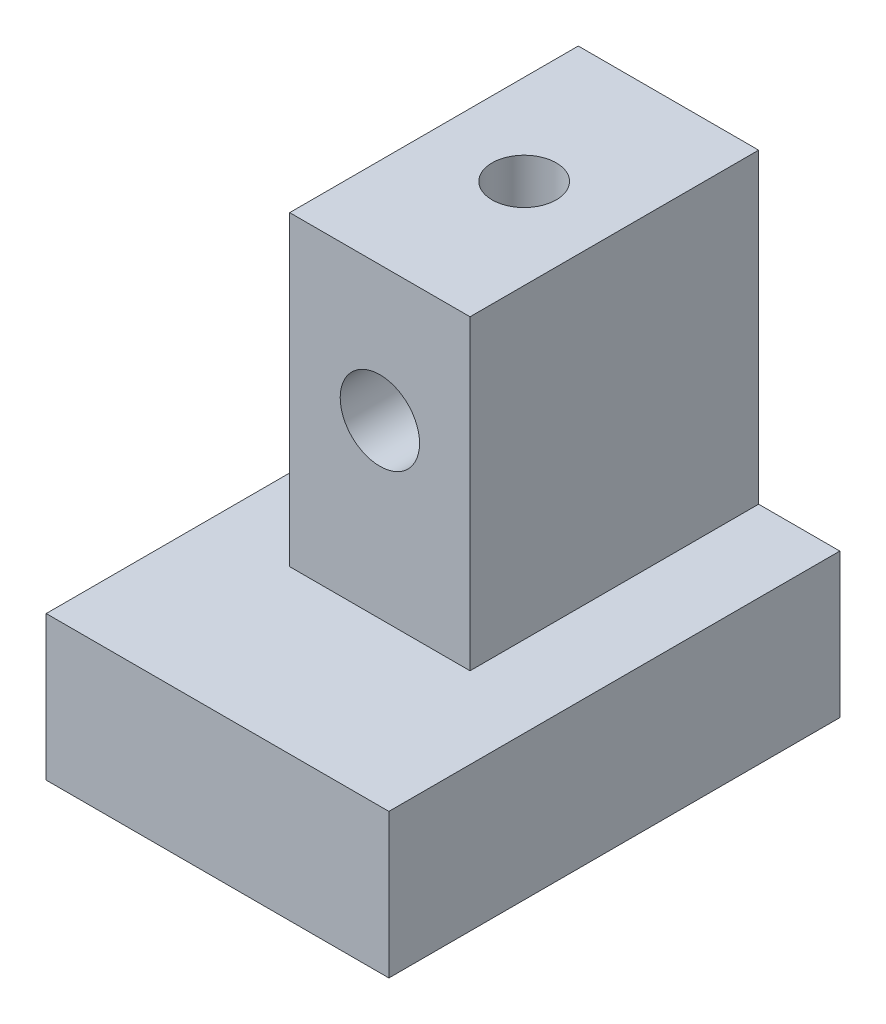
ISO-10303-21;
HEADER;
FILE_DESCRIPTION(('STEP AP214'),'2;1');
FILE_NAME('part.step','',(''),(''),'','','');
FILE_SCHEMA(('AUTOMOTIVE_DESIGN { 1 0 10303 214 1 1 1 1 }'));
ENDSEC;
DATA;
#1=APPLICATION_CONTEXT('core data for automotive mechanical design processes');
#2=APPLICATION_PROTOCOL_DEFINITION('international standard','automotive_design',2000,#1);
#3=PRODUCT_CONTEXT('',#1,'mechanical');
#4=PRODUCT('Part','Part','',(#3));
#5=PRODUCT_RELATED_PRODUCT_CATEGORY('part','',(#4));
#6=PRODUCT_DEFINITION_FORMATION('','',#4);
#7=PRODUCT_DEFINITION_CONTEXT('part definition',#1,'design');
#8=PRODUCT_DEFINITION('design','',#6,#7);
#9=PRODUCT_DEFINITION_SHAPE('','',#8);
#10=(LENGTH_UNIT() NAMED_UNIT(*) SI_UNIT(.MILLI.,.METRE.));
#11=(NAMED_UNIT(*) PLANE_ANGLE_UNIT() SI_UNIT($,.RADIAN.));
#12=(NAMED_UNIT(*) SI_UNIT($,.STERADIAN.) SOLID_ANGLE_UNIT());
#13=UNCERTAINTY_MEASURE_WITH_UNIT(LENGTH_MEASURE(1.E-05),#10,'distance_accuracy_value','');
#14=(GEOMETRIC_REPRESENTATION_CONTEXT(3) GLOBAL_UNCERTAINTY_ASSIGNED_CONTEXT((#13)) GLOBAL_UNIT_ASSIGNED_CONTEXT((#10,
#11,#12)) REPRESENTATION_CONTEXT('',''));
#15=CARTESIAN_POINT('',(0.,0.,0.));
#16=DIRECTION('',(0.,0.,1.));
#17=DIRECTION('',(1.,0.,0.));
#18=AXIS2_PLACEMENT_3D('',#15,#16,#17);
#19=CARTESIAN_POINT('',(6.0325,-7.9375,15.875));
#20=DIRECTION('',(-1.,0.,0.));
#21=DIRECTION('',(0.,0.,1.));
#22=AXIS2_PLACEMENT_3D('',#19,#20,#21);
#23=PLANE('',#22);
#24=DIRECTION('',(0.,0.,-1.));
#25=VECTOR('',#24,1.);
#26=CARTESIAN_POINT('',(6.0325,-2.8575,15.875));
#27=LINE('',#26,#25);
#28=CARTESIAN_POINT('',(6.0325,-2.8575,15.875));
#29=VERTEX_POINT('',#28);
#30=CARTESIAN_POINT('',(6.0325,-2.8575,0.));
#31=VERTEX_POINT('',#30);
#32=EDGE_CURVE('E109',#29,#31,#27,.T.);
#33=ORIENTED_EDGE('',*,*,#32,.F.);
#34=DIRECTION('',(0.,1.,0.));
#35=VECTOR('',#34,1.);
#36=CARTESIAN_POINT('',(6.0325,-7.9375,15.875));
#37=LINE('',#36,#35);
#38=CARTESIAN_POINT('',(6.0325,-7.9375,15.875));
#39=VERTEX_POINT('',#38);
#40=EDGE_CURVE('E81',#39,#29,#37,.T.);
#41=ORIENTED_EDGE('',*,*,#40,.F.);
#42=DIRECTION('',(0.,0.,-1.));
#43=VECTOR('',#42,1.);
#44=CARTESIAN_POINT('',(6.0325,-7.9375,15.875));
#45=LINE('',#44,#43);
#46=CARTESIAN_POINT('',(6.0325,-7.9375,0.));
#47=VERTEX_POINT('',#46);
#48=EDGE_CURVE('E74',#39,#47,#45,.T.);
#49=ORIENTED_EDGE('',*,*,#48,.T.);
#50=DIRECTION('',(0.,1.,0.));
#51=VECTOR('',#50,1.);
#52=CARTESIAN_POINT('',(6.0325,-7.9375,0.));
#53=LINE('',#52,#51);
#54=EDGE_CURVE('E88',#47,#31,#53,.T.);
#55=ORIENTED_EDGE('',*,*,#54,.T.);
#56=EDGE_LOOP('',(#33,#41,#49,#55));
#57=FACE_BOUND('',#56,.T.);
#58=ADVANCED_FACE('F35',(#57),#23,.F.);
#59=CARTESIAN_POINT('',(-6.0325,7.9375,15.875));
#60=DIRECTION('',(0.,-1.,0.));
#61=DIRECTION('',(0.,0.,-1.));
#62=AXIS2_PLACEMENT_3D('',#59,#60,#61);
#63=PLANE('',#62);
#64=CARTESIAN_POINT('',(0.,7.9375,5.08));
#65=DIRECTION('',(0.,1.,0.));
#66=DIRECTION('',(0.,0.,1.));
#67=AXIS2_PLACEMENT_3D('',#64,#65,#66);
#68=CIRCLE('',#67,1.13029999999999);
#69=CARTESIAN_POINT('',(0.,7.9375,6.21029999999999));
#70=VERTEX_POINT('',#69);
#71=EDGE_CURVE('E186',#70,#70,#68,.T.);
#72=ORIENTED_EDGE('',*,*,#71,.F.);
#73=EDGE_LOOP('',(#72));
#74=FACE_BOUND('',#73,.T.);
#75=DIRECTION('',(0.,0.,-1.));
#76=VECTOR('',#75,1.);
#77=CARTESIAN_POINT('',(3.175,7.9375,10.16));
#78=LINE('',#77,#76);
#79=CARTESIAN_POINT('',(3.175,7.9375,10.16));
#80=VERTEX_POINT('',#79);
#81=CARTESIAN_POINT('',(3.175,7.9375,0.));
#82=VERTEX_POINT('',#81);
#83=EDGE_CURVE('E182',#80,#82,#78,.T.);
#84=ORIENTED_EDGE('',*,*,#83,.T.);
#85=DIRECTION('',(-1.,0.,0.));
#86=VECTOR('',#85,1.);
#87=CARTESIAN_POINT('',(-6.0325,7.9375,0.));
#88=LINE('',#87,#86);
#89=CARTESIAN_POINT('',(-3.175,7.9375,0.));
#90=VERTEX_POINT('',#89);
#91=EDGE_CURVE('E95',#82,#90,#88,.T.);
#92=ORIENTED_EDGE('',*,*,#91,.T.);
#93=DIRECTION('',(0.,0.,1.));
#94=VECTOR('',#93,1.);
#95=CARTESIAN_POINT('',(-3.175,7.9375,10.16));
#96=LINE('',#95,#94);
#97=CARTESIAN_POINT('',(-3.175,7.9375,10.16));
#98=VERTEX_POINT('',#97);
#99=EDGE_CURVE('E49',#90,#98,#96,.T.);
#100=ORIENTED_EDGE('',*,*,#99,.T.);
#101=DIRECTION('',(1.,0.,0.));
#102=VECTOR('',#101,1.);
#103=CARTESIAN_POINT('',(-3.175,7.9375,10.16));
#104=LINE('',#103,#102);
#105=EDGE_CURVE('E128',#98,#80,#104,.T.);
#106=ORIENTED_EDGE('',*,*,#105,.T.);
#107=EDGE_LOOP('',(#84,#92,#100,#106));
#108=FACE_BOUND('',#107,.T.);
#109=ADVANCED_FACE('F180',(#74,#108),#63,.F.);
#110=CARTESIAN_POINT('',(-6.0325,-7.9375,15.875));
#111=DIRECTION('',(1.,0.,0.));
#112=DIRECTION('',(0.,0.,-1.));
#113=AXIS2_PLACEMENT_3D('',#110,#111,#112);
#114=PLANE('',#113);
#115=DIRECTION('',(0.,0.,1.));
#116=VECTOR('',#115,1.);
#117=CARTESIAN_POINT('',(-6.0325,-2.8575,15.875));
#118=LINE('',#117,#116);
#119=CARTESIAN_POINT('',(-6.0325,-2.8575,0.));
#120=VERTEX_POINT('',#119);
#121=CARTESIAN_POINT('',(-6.0325,-2.8575,15.875));
#122=VERTEX_POINT('',#121);
#123=EDGE_CURVE('E101',#120,#122,#118,.T.);
#124=ORIENTED_EDGE('',*,*,#123,.F.);
#125=DIRECTION('',(0.,-1.,0.));
#126=VECTOR('',#125,1.);
#127=CARTESIAN_POINT('',(-6.0325,-7.9375,0.));
#128=LINE('',#127,#126);
#129=CARTESIAN_POINT('',(-6.0325,-7.9375,0.));
#130=VERTEX_POINT('',#129);
#131=EDGE_CURVE('E82',#120,#130,#128,.T.);
#132=ORIENTED_EDGE('',*,*,#131,.T.);
#133=DIRECTION('',(0.,0.,-1.));
#134=VECTOR('',#133,1.);
#135=CARTESIAN_POINT('',(-6.0325,-7.9375,15.875));
#136=LINE('',#135,#134);
#137=CARTESIAN_POINT('',(-6.0325,-7.9375,15.875));
#138=VERTEX_POINT('',#137);
#139=EDGE_CURVE('E77',#138,#130,#136,.T.);
#140=ORIENTED_EDGE('',*,*,#139,.F.);
#141=DIRECTION('',(0.,-1.,0.));
#142=VECTOR('',#141,1.);
#143=CARTESIAN_POINT('',(-6.0325,-7.9375,15.875));
#144=LINE('',#143,#142);
#145=EDGE_CURVE('E140',#122,#138,#144,.T.);
#146=ORIENTED_EDGE('',*,*,#145,.F.);
#147=EDGE_LOOP('',(#124,#132,#140,#146));
#148=FACE_BOUND('',#147,.T.);
#149=ADVANCED_FACE('F147',(#148),#114,.F.);
#150=CARTESIAN_POINT('',(0.,0.,15.875));
#151=DIRECTION('',(0.,0.,-1.));
#152=DIRECTION('',(-1.,0.,0.));
#153=AXIS2_PLACEMENT_3D('',#150,#151,#152);
#154=PLANE('',#153);
#155=DIRECTION('',(1.,0.,0.));
#156=VECTOR('',#155,1.);
#157=CARTESIAN_POINT('',(0.,-2.8575,15.875));
#158=LINE('',#157,#156);
#159=EDGE_CURVE('E114',#122,#29,#158,.T.);
#160=ORIENTED_EDGE('',*,*,#159,.F.);
#161=ORIENTED_EDGE('',*,*,#145,.T.);
#162=DIRECTION('',(1.,0.,0.));
#163=VECTOR('',#162,1.);
#164=CARTESIAN_POINT('',(-6.0325,-7.9375,15.875));
#165=LINE('',#164,#163);
#166=EDGE_CURVE('E58',#138,#39,#165,.T.);
#167=ORIENTED_EDGE('',*,*,#166,.T.);
#168=ORIENTED_EDGE('',*,*,#40,.T.);
#169=EDGE_LOOP('',(#160,#161,#167,#168));
#170=FACE_BOUND('',#169,.T.);
#171=ADVANCED_FACE('F143',(#170),#154,.F.);
#172=CARTESIAN_POINT('',(0.,0.,0.));
#173=DIRECTION('',(0.,0.,-1.));
#174=DIRECTION('',(-1.,0.,0.));
#175=AXIS2_PLACEMENT_3D('',#172,#173,#174);
#176=PLANE('',#175);
#177=CARTESIAN_POINT('',(0.,3.1877,0.));
#178=DIRECTION('',(0.,0.,-1.));
#179=DIRECTION('',(-1.,0.,0.));
#180=AXIS2_PLACEMENT_3D('',#177,#178,#179);
#181=CIRCLE('',#180,1.397);
#182=CARTESIAN_POINT('',(-1.397,3.1877,0.));
#183=VERTEX_POINT('',#182);
#184=EDGE_CURVE('E96',#183,#183,#181,.T.);
#185=ORIENTED_EDGE('',*,*,#184,.F.);
#186=EDGE_LOOP('',(#185));
#187=FACE_BOUND('',#186,.T.);
#188=ORIENTED_EDGE('',*,*,#91,.F.);
#189=DIRECTION('',(0.,1.,0.));
#190=VECTOR('',#189,1.);
#191=CARTESIAN_POINT('',(3.175,-2.8575,0.));
#192=LINE('',#191,#190);
#193=CARTESIAN_POINT('',(3.175,-2.8575,0.));
#194=VERTEX_POINT('',#193);
#195=EDGE_CURVE('E132',#194,#82,#192,.T.);
#196=ORIENTED_EDGE('',*,*,#195,.F.);
#197=DIRECTION('',(1.,0.,0.));
#198=VECTOR('',#197,1.);
#199=CARTESIAN_POINT('',(0.,-2.8575,0.));
#200=LINE('',#199,#198);
#201=EDGE_CURVE('E42',#194,#31,#200,.T.);
#202=ORIENTED_EDGE('',*,*,#201,.T.);
#203=ORIENTED_EDGE('',*,*,#54,.F.);
#204=DIRECTION('',(1.,0.,0.));
#205=VECTOR('',#204,1.);
#206=CARTESIAN_POINT('',(-6.0325,-7.9375,0.));
#207=LINE('',#206,#205);
#208=EDGE_CURVE('E71',#130,#47,#207,.T.);
#209=ORIENTED_EDGE('',*,*,#208,.F.);
#210=ORIENTED_EDGE('',*,*,#131,.F.);
#211=CARTESIAN_POINT('',(-3.175,-2.8575,0.));
#212=VERTEX_POINT('',#211);
#213=EDGE_CURVE('E11',#120,#212,#200,.T.);
#214=ORIENTED_EDGE('',*,*,#213,.T.);
#215=DIRECTION('',(0.,1.,0.));
#216=VECTOR('',#215,1.);
#217=CARTESIAN_POINT('',(-3.175,-2.8575,0.));
#218=LINE('',#217,#216);
#219=EDGE_CURVE('E125',#212,#90,#218,.T.);
#220=ORIENTED_EDGE('',*,*,#219,.T.);
#221=EDGE_LOOP('',(#188,#196,#202,#203,#209,#210,#214,#220));
#222=FACE_BOUND('',#221,.T.);
#223=ADVANCED_FACE('F92',(#187,#222),#176,.T.);
#224=CARTESIAN_POINT('',(0.,3.1877,15.875));
#225=DIRECTION('',(0.,0.,-1.));
#226=DIRECTION('',(-1.,0.,0.));
#227=AXIS2_PLACEMENT_3D('',#224,#225,#226);
#228=CYLINDRICAL_SURFACE('',#227,1.397);
#229=CARTESIAN_POINT('',(0.,4.5847,6.21029999999999));
#230=CARTESIAN_POINT('',(0.0541050358313921,4.58469552957851,6.21029540501797));
#231=CARTESIAN_POINT('',(0.108269218939366,4.58152565830312,6.20638389300422));
#232=CARTESIAN_POINT('',(0.214836720331272,4.56912903179672,6.19100631679273));
#233=CARTESIAN_POINT('',(0.267236862141601,4.55989190677702,6.17952731857473));
#234=CARTESIAN_POINT('',(0.368459122197511,4.53622981846154,6.14985117956447));
#235=CARTESIAN_POINT('',(0.417301328352082,4.52183722720497,6.13169594149329));
#236=CARTESIAN_POINT('',(0.5108510798128,4.4888937024647,6.08957683726046));
#237=CARTESIAN_POINT('',(0.555558084585463,4.47034222643379,6.06561221320228));
#238=CARTESIAN_POINT('',(0.655413592807388,4.42304447630234,6.00335964339549));
#239=CARTESIAN_POINT('',(0.708663714551572,4.39301295687296,5.96300341912234));
#240=CARTESIAN_POINT('',(0.806487473841614,4.32988633584486,5.87468228569944));
#241=CARTESIAN_POINT('',(0.851035545848549,4.29678261660483,5.82669568695502));
#242=CARTESIAN_POINT('',(0.931883244128168,4.2298117304259,5.72309365255873));
#243=CARTESIAN_POINT('',(0.968034775518257,4.195940974602,5.66736548799814));
#244=CARTESIAN_POINT('',(1.03064230905732,4.13182324628995,5.54885530184019));
#245=CARTESIAN_POINT('',(1.05712982630524,4.10156471525679,5.48609709700727));
#246=CARTESIAN_POINT('',(1.08991854376673,4.0617966794791,5.38200863205291));
#247=CARTESIAN_POINT('',(1.09999534648714,4.04897391270777,5.34315400244716));
#248=CARTESIAN_POINT('',(1.11605773977745,4.02805610567904,5.26341190109913));
#249=CARTESIAN_POINT('',(1.12205351152324,4.01994930763681,5.22252976319197));
#250=CARTESIAN_POINT('',(1.12953094622262,4.00977941964549,5.13916266609568));
#251=CARTESIAN_POINT('',(1.1309688212688,4.00777496235516,5.09666610522649));
#252=CARTESIAN_POINT('',(1.12904779282537,4.01041562126187,5.01197955432874));
#253=CARTESIAN_POINT('',(1.12568560950463,4.01506528415689,4.96978979373723));
#254=CARTESIAN_POINT('',(1.11372075510256,4.03111162342859,4.88133059729616));
#255=CARTESIAN_POINT('',(1.10445200438508,4.04335960790657,4.83531389384168));
#256=CARTESIAN_POINT('',(1.0808946528826,4.07292981319021,4.7462637585169));
#257=CARTESIAN_POINT('',(1.06659073413127,4.0902674908082,4.70323991529749));
#258=CARTESIAN_POINT('',(1.02500237630327,4.13765356503597,4.59880149768517));
#259=CARTESIAN_POINT('',(0.994833474592042,4.16963012079624,4.53942416771066));
#260=CARTESIAN_POINT('',(0.925285120798586,4.23544488737185,4.42748868497733));
#261=CARTESIAN_POINT('',(0.885891366311645,4.26928592597434,4.37494132029459));
#262=CARTESIAN_POINT('',(0.796676765966574,4.33667541466074,4.27532985728206));
#263=CARTESIAN_POINT('',(0.746560232682577,4.37017911079607,4.22849768100485));
#264=CARTESIAN_POINT('',(0.636944330633632,4.43263745943391,4.1437026654372));
#265=CARTESIAN_POINT('',(0.577469839326125,4.46160377796048,4.10571695430049));
#266=CARTESIAN_POINT('',(0.467868701241059,4.50494851336916,4.04979241515704));
#267=CARTESIAN_POINT('',(0.419802665576033,4.52113953662237,4.02921933131483));
#268=CARTESIAN_POINT('',(0.320000760323876,4.54853715708955,3.99466193115921));
#269=CARTESIAN_POINT('',(0.268267644524536,4.55974744954476,3.98067272975606));
#270=CARTESIAN_POINT('',(0.162097540931989,4.57630860860385,3.96007103569309));
#271=CARTESIAN_POINT('',(0.107646734178922,4.58162546362195,3.95350135774303));
#272=CARTESIAN_POINT('',(-0.0018776608548296,4.5857718331327,3.94837436205778));
#273=CARTESIAN_POINT('',(-0.0569510832035583,4.58460303723987,3.94981495752));
#274=CARTESIAN_POINT('',(-0.160843138657269,4.57629958875007,3.96009582274761));
#275=CARTESIAN_POINT('',(-0.209776856675041,4.56971426651096,3.96825481214381));
#276=CARTESIAN_POINT('',(-0.305320095911234,4.55179409440662,3.99061195929369));
#277=CARTESIAN_POINT('',(-0.351929318911123,4.5404586368731,4.00481088971954));
#278=CARTESIAN_POINT('',(-0.444195676110439,4.51311737403293,4.03941421269178));
#279=CARTESIAN_POINT('',(-0.489686246545872,4.49690486248448,4.06009544805374));
#280=CARTESIAN_POINT('',(-0.576523016332528,4.46105855675656,4.10653800942004));
#281=CARTESIAN_POINT('',(-0.617866354297848,4.4414224256795,4.13230280695901));
#282=CARTESIAN_POINT('',(-0.713661377594662,4.39036951862211,4.20072917964738));
#283=CARTESIAN_POINT('',(-0.765692404516037,4.35761495289932,4.24579059562915));
#284=CARTESIAN_POINT('',(-0.860287507341861,4.28992618148826,4.34369937279583));
#285=CARTESIAN_POINT('',(-0.902830123500054,4.25498725928462,4.3965639426942));
#286=CARTESIAN_POINT('',(-0.972164109279999,4.19186117134437,4.5005721763848));
#287=CARTESIAN_POINT('',(-1.00038437242345,4.16348369900904,4.55065323122201));
#288=CARTESIAN_POINT('',(-1.04942238167557,4.11052851189968,4.656139186586));
#289=CARTESIAN_POINT('',(-1.07026181793013,4.08593978545011,4.71152786958102));
#290=CARTESIAN_POINT('',(-1.09760544162795,4.05209067399691,4.80728729901883));
#291=CARTESIAN_POINT('',(-1.10657385472121,4.04047944473192,4.84610480883141));
#292=CARTESIAN_POINT('',(-1.12042235214605,4.02220354422072,4.92556506939033));
#293=CARTESIAN_POINT('',(-1.12531182023948,4.01552752340212,4.96620340284828));
#294=CARTESIAN_POINT('',(-1.13062427819384,4.00826210947489,5.04865972574521));
#295=CARTESIAN_POINT('',(-1.13101300433598,4.00771940949729,5.09048433776062));
#296=CARTESIAN_POINT('',(-1.12719250526273,4.01295985866837,5.17353607985147));
#297=CARTESIAN_POINT('',(-1.12297810762872,4.01875012402668,5.21476248494106));
#298=CARTESIAN_POINT('',(-1.10904662550883,4.03727605301121,5.3036347848843));
#299=CARTESIAN_POINT('',(-1.09838294072514,4.05118693004977,5.35087611995696));
#300=CARTESIAN_POINT('',(-1.07179997544887,4.08396933247201,5.44206822211712));
#301=CARTESIAN_POINT('',(-1.0558645971078,4.10285601574763,5.48600839797968));
#302=CARTESIAN_POINT('',(-1.01014065211649,4.15356474110931,5.59185811317498));
#303=CARTESIAN_POINT('',(-0.977417631474094,4.18710948050135,5.65166613899386));
#304=CARTESIAN_POINT('',(-0.902310262813706,4.25542841958956,5.76409474493229));
#305=CARTESIAN_POINT('',(-0.859912694851141,4.29020424607448,5.81670533117019));
#306=CARTESIAN_POINT('',(-0.764529610264586,4.35843686897011,5.91539575673477));
#307=CARTESIAN_POINT('',(-0.711324631851276,4.39184548123058,5.96129924635263));
#308=CARTESIAN_POINT('',(-0.595255193882458,4.45322763339313,6.0434667786143));
#309=CARTESIAN_POINT('',(-0.532418026993561,4.48121603942796,6.07975729066602));
#310=CARTESIAN_POINT('',(-0.419078598279651,4.52126726738501,6.13096953977575));
#311=CARTESIAN_POINT('',(-0.370778700596553,4.53557799746587,6.14902860124818));
#312=CARTESIAN_POINT('',(-0.271063129265703,4.55910042561769,6.17853950465264));
#313=CARTESIAN_POINT('',(-0.219654927014874,4.56832385053828,6.19000654458848));
#314=CARTESIAN_POINT('',(-0.139827198573727,4.57796378502807,6.20196592322761));
#315=CARTESIAN_POINT('',(-0.11202211530175,4.58048237267142,6.2050837166238));
#316=CARTESIAN_POINT('',(-0.0561500432846329,4.58385185483252,6.20925221338169));
#317=CARTESIAN_POINT('',(-0.0280829890316433,4.58470232035329,6.2103023850059));
#318=CARTESIAN_POINT('',(0.,4.5847,6.21029999999999));
#319=B_SPLINE_CURVE_WITH_KNOTS('',3,(#229,#230,#231,#232,#233,#234,#235,#236,#237,#238,#239,
#240,#241,#242,#243,#244,#245,#246,#247,#248,#249,#250,#251,#252,#253,#254,#255,#256,#257,#258,
#259,#260,#261,#262,#263,#264,#265,#266,#267,#268,#269,#270,#271,#272,#273,#274,#275,#276,#277,
#278,#279,#280,#281,#282,#283,#284,#285,#286,#287,#288,#289,#290,#291,#292,#293,#294,#295,#296,
#297,#298,#299,#300,#301,#302,#303,#304,#305,#306,#307,#308,#309,#310,#311,#312,#313,#314,#315,
#316,#317,#318),.UNSPECIFIED.,.T.,.F.,(4,2,2,2,2,2,2,2,2,2,2,2,2,2,2,2,2,2,2,2,2,2,2,2,2,2,2,2,
2,2,2,2,2,2,2,2,2,2,2,2,2,2,2,2,4),(0.,0.162194000633683,0.324665937455276,0.486135072165633,
0.647625283598847,0.86622336389451,1.08545430574276,1.30829956484034,1.5304114718134,
1.65643360735512,1.7821401846428,1.90905082658443,2.03604822679335,2.18077535892997,
2.32594663958187,2.54642360152943,2.76724468566175,2.9951980522569,3.22255535307065,
3.38610851936904,3.54954014090503,3.71391010910663,3.87823725834515,4.0276968547538,
4.177175576849,4.3341928824975,4.49131778779022,4.71880460602027,4.94680082364145,
5.13854921109979,5.32972933561119,5.45380050041997,5.57758544164998,5.70231213167584,
5.82717911838147,5.97750044254047,6.12828509739452,6.35504553692707,6.58211771251255,
6.81436966602408,7.04597530309737,7.2058917645197,7.3654380420544,7.44960250710565,
7.53378861419906),.UNSPECIFIED.);
#320=CARTESIAN_POINT('',(0.,4.5847,6.21029999999999));
#321=VERTEX_POINT('',#320);
#322=EDGE_CURVE('E183',#321,#321,#319,.T.);
#323=ORIENTED_EDGE('',*,*,#322,.T.);
#324=EDGE_LOOP('',(#323));
#325=FACE_BOUND('',#324,.T.);
#326=ORIENTED_EDGE('',*,*,#184,.T.);
#327=EDGE_LOOP('',(#326));
#328=FACE_BOUND('',#327,.T.);
#329=CARTESIAN_POINT('',(0.,3.1877,10.16));
#330=DIRECTION('',(0.,0.,1.));
#331=DIRECTION('',(1.,0.,0.));
#332=AXIS2_PLACEMENT_3D('',#329,#330,#331);
#333=CIRCLE('',#332,1.397);
#334=CARTESIAN_POINT('',(1.397,3.1877,10.16));
#335=VERTEX_POINT('',#334);
#336=EDGE_CURVE('E107',#335,#335,#333,.F.);
#337=ORIENTED_EDGE('',*,*,#336,.F.);
#338=EDGE_LOOP('',(#337));
#339=FACE_BOUND('',#338,.T.);
#340=ADVANCED_FACE('F223',(#325,#328,#339),#228,.F.);
#341=CARTESIAN_POINT('',(-6.0325,-7.9375,15.875));
#342=DIRECTION('',(0.,1.,0.));
#343=DIRECTION('',(0.,0.,1.));
#344=AXIS2_PLACEMENT_3D('',#341,#342,#343);
#345=PLANE('',#344);
#346=ORIENTED_EDGE('',*,*,#208,.T.);
#347=ORIENTED_EDGE('',*,*,#48,.F.);
#348=ORIENTED_EDGE('',*,*,#166,.F.);
#349=ORIENTED_EDGE('',*,*,#139,.T.);
#350=EDGE_LOOP('',(#346,#347,#348,#349));
#351=FACE_BOUND('',#350,.T.);
#352=ADVANCED_FACE('F73',(#351),#345,.F.);
#353=CARTESIAN_POINT('',(-3.175,-2.8575,10.16));
#354=DIRECTION('',(0.,0.,1.));
#355=DIRECTION('',(1.,0.,0.));
#356=AXIS2_PLACEMENT_3D('',#353,#354,#355);
#357=PLANE('',#356);
#358=ORIENTED_EDGE('',*,*,#105,.F.);
#359=DIRECTION('',(0.,1.,0.));
#360=VECTOR('',#359,1.);
#361=CARTESIAN_POINT('',(-3.175,-2.8575,10.16));
#362=LINE('',#361,#360);
#363=CARTESIAN_POINT('',(-3.175,-2.8575,10.16));
#364=VERTEX_POINT('',#363);
#365=EDGE_CURVE('E117',#364,#98,#362,.T.);
#366=ORIENTED_EDGE('',*,*,#365,.F.);
#367=DIRECTION('',(1.,0.,0.));
#368=VECTOR('',#367,1.);
#369=CARTESIAN_POINT('',(-3.175,-2.8575,10.16));
#370=LINE('',#369,#368);
#371=CARTESIAN_POINT('',(3.175,-2.8575,10.16));
#372=VERTEX_POINT('',#371);
#373=EDGE_CURVE('E134',#364,#372,#370,.T.);
#374=ORIENTED_EDGE('',*,*,#373,.T.);
#375=DIRECTION('',(0.,1.,0.));
#376=VECTOR('',#375,1.);
#377=CARTESIAN_POINT('',(3.175,-2.8575,10.16));
#378=LINE('',#377,#376);
#379=EDGE_CURVE('E110',#372,#80,#378,.T.);
#380=ORIENTED_EDGE('',*,*,#379,.T.);
#381=EDGE_LOOP('',(#358,#366,#374,#380));
#382=FACE_BOUND('',#381,.T.);
#383=ORIENTED_EDGE('',*,*,#336,.T.);
#384=EDGE_LOOP('',(#383));
#385=FACE_BOUND('',#384,.T.);
#386=ADVANCED_FACE('F222',(#382,#385),#357,.T.);
#387=CARTESIAN_POINT('',(0.,-2.8575,0.));
#388=DIRECTION('',(0.,1.,0.));
#389=DIRECTION('',(0.,0.,1.));
#390=AXIS2_PLACEMENT_3D('',#387,#388,#389);
#391=PLANE('',#390);
#392=ORIENTED_EDGE('',*,*,#123,.T.);
#393=ORIENTED_EDGE('',*,*,#159,.T.);
#394=ORIENTED_EDGE('',*,*,#32,.T.);
#395=ORIENTED_EDGE('',*,*,#201,.F.);
#396=DIRECTION('',(0.,0.,-1.));
#397=VECTOR('',#396,1.);
#398=CARTESIAN_POINT('',(3.175,-2.8575,10.16));
#399=LINE('',#398,#397);
#400=EDGE_CURVE('E173',#372,#194,#399,.T.);
#401=ORIENTED_EDGE('',*,*,#400,.F.);
#402=ORIENTED_EDGE('',*,*,#373,.F.);
#403=DIRECTION('',(0.,0.,1.));
#404=VECTOR('',#403,1.);
#405=CARTESIAN_POINT('',(-3.175,-2.8575,10.16));
#406=LINE('',#405,#404);
#407=EDGE_CURVE('E177',#212,#364,#406,.T.);
#408=ORIENTED_EDGE('',*,*,#407,.F.);
#409=ORIENTED_EDGE('',*,*,#213,.F.);
#410=EDGE_LOOP('',(#392,#393,#394,#395,#401,#402,#408,#409));
#411=FACE_BOUND('',#410,.T.);
#412=ADVANCED_FACE('F171',(#411),#391,.T.);
#413=CARTESIAN_POINT('',(3.175,-2.8575,10.16));
#414=DIRECTION('',(1.,0.,0.));
#415=DIRECTION('',(0.,0.,-1.));
#416=AXIS2_PLACEMENT_3D('',#413,#414,#415);
#417=PLANE('',#416);
#418=ORIENTED_EDGE('',*,*,#83,.F.);
#419=ORIENTED_EDGE('',*,*,#379,.F.);
#420=ORIENTED_EDGE('',*,*,#400,.T.);
#421=ORIENTED_EDGE('',*,*,#195,.T.);
#422=EDGE_LOOP('',(#418,#419,#420,#421));
#423=FACE_BOUND('',#422,.T.);
#424=ADVANCED_FACE('F175',(#423),#417,.T.);
#425=CARTESIAN_POINT('',(-3.175,-2.8575,10.16));
#426=DIRECTION('',(-1.,0.,0.));
#427=DIRECTION('',(0.,0.,1.));
#428=AXIS2_PLACEMENT_3D('',#425,#426,#427);
#429=PLANE('',#428);
#430=ORIENTED_EDGE('',*,*,#99,.F.);
#431=ORIENTED_EDGE('',*,*,#219,.F.);
#432=ORIENTED_EDGE('',*,*,#407,.T.);
#433=ORIENTED_EDGE('',*,*,#365,.T.);
#434=EDGE_LOOP('',(#430,#431,#432,#433));
#435=FACE_BOUND('',#434,.T.);
#436=ADVANCED_FACE('F201',(#435),#429,.T.);
#437=CARTESIAN_POINT('',(0.,7.9375,5.08));
#438=DIRECTION('',(0.,1.,0.));
#439=DIRECTION('',(0.,0.,1.));
#440=AXIS2_PLACEMENT_3D('',#437,#438,#439);
#441=CYLINDRICAL_SURFACE('',#440,1.13029999999999);
#442=ORIENTED_EDGE('',*,*,#322,.F.);
#443=EDGE_LOOP('',(#442));
#444=FACE_BOUND('',#443,.T.);
#445=ORIENTED_EDGE('',*,*,#71,.T.);
#446=EDGE_LOOP('',(#445));
#447=FACE_BOUND('',#446,.T.);
#448=ADVANCED_FACE('F198',(#444,#447),#441,.F.);
#449=CLOSED_SHELL('',(#58,#109,#149,#171,#223,#340,#352,#386,#412,#424,#436,#448));
#450=MANIFOLD_SOLID_BREP('B2',#449);
#451=ADVANCED_BREP_SHAPE_REPRESENTATION('',(#18,#450),#14);
#452=SHAPE_DEFINITION_REPRESENTATION(#9,#451);
ENDSEC;
END-ISO-10303-21;
